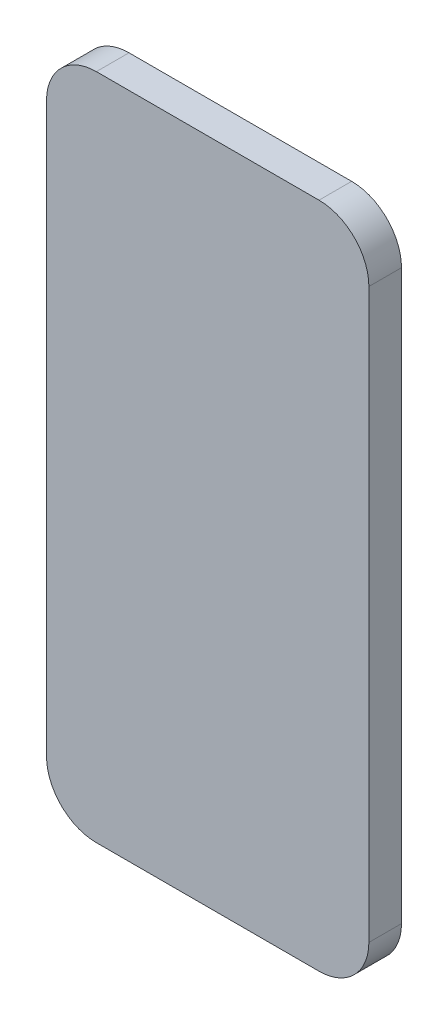
ISO-10303-21;
HEADER;
FILE_DESCRIPTION(('STEP AP214'),'2;1');
FILE_NAME('part.step','',(''),(''),'','','');
FILE_SCHEMA(('AUTOMOTIVE_DESIGN { 1 0 10303 214 1 1 1 1 }'));
ENDSEC;
DATA;
#1=APPLICATION_CONTEXT('core data for automotive mechanical design processes');
#2=APPLICATION_PROTOCOL_DEFINITION('international standard','automotive_design',2000,#1);
#3=PRODUCT_CONTEXT('',#1,'mechanical');
#4=PRODUCT('Part','Part','',(#3));
#5=PRODUCT_RELATED_PRODUCT_CATEGORY('part','',(#4));
#6=PRODUCT_DEFINITION_FORMATION('','',#4);
#7=PRODUCT_DEFINITION_CONTEXT('part definition',#1,'design');
#8=PRODUCT_DEFINITION('design','',#6,#7);
#9=PRODUCT_DEFINITION_SHAPE('','',#8);
#10=(LENGTH_UNIT() NAMED_UNIT(*) SI_UNIT(.MILLI.,.METRE.));
#11=(NAMED_UNIT(*) PLANE_ANGLE_UNIT() SI_UNIT($,.RADIAN.));
#12=(NAMED_UNIT(*) SI_UNIT($,.STERADIAN.) SOLID_ANGLE_UNIT());
#13=UNCERTAINTY_MEASURE_WITH_UNIT(LENGTH_MEASURE(1.E-05),#10,'distance_accuracy_value','');
#14=(GEOMETRIC_REPRESENTATION_CONTEXT(3) GLOBAL_UNCERTAINTY_ASSIGNED_CONTEXT((#13)) GLOBAL_UNIT_ASSIGNED_CONTEXT((#10,
#11,#12)) REPRESENTATION_CONTEXT('',''));
#15=CARTESIAN_POINT('',(0.,0.,0.));
#16=DIRECTION('',(0.,0.,1.));
#17=DIRECTION('',(1.,0.,0.));
#18=AXIS2_PLACEMENT_3D('',#15,#16,#17);
#19=CARTESIAN_POINT('',(12.8139705882353,-72.6825980392157,7.85));
#20=DIRECTION('',(0.,0.,-1.));
#21=DIRECTION('',(-1.,0.,0.));
#22=AXIS2_PLACEMENT_3D('',#19,#20,#21);
#23=CYLINDRICAL_SURFACE('',#22,12.);
#24=CARTESIAN_POINT('',(12.8139705882353,-72.6825980392157,0.));
#25=DIRECTION('',(0.,0.,1.));
#26=DIRECTION('',(1.,0.,0.));
#27=AXIS2_PLACEMENT_3D('',#24,#25,#26);
#28=CIRCLE('',#27,12.);
#29=CARTESIAN_POINT('',(12.8139705882352,-84.6825980392157,0.));
#30=VERTEX_POINT('',#29);
#31=CARTESIAN_POINT('',(24.8139705882353,-72.6825980392156,0.));
#32=VERTEX_POINT('',#31);
#33=EDGE_CURVE('E137',#30,#32,#28,.T.);
#34=ORIENTED_EDGE('',*,*,#33,.T.);
#35=DIRECTION('',(0.,0.,-1.));
#36=VECTOR('',#35,1.);
#37=CARTESIAN_POINT('',(24.8139705882353,-72.6825980392156,7.85));
#38=LINE('',#37,#36);
#39=CARTESIAN_POINT('',(24.8139705882353,-72.6825980392156,7.85));
#40=VERTEX_POINT('',#39);
#41=EDGE_CURVE('E11',#40,#32,#38,.T.);
#42=ORIENTED_EDGE('',*,*,#41,.F.);
#43=CARTESIAN_POINT('',(12.8139705882353,-72.6825980392157,7.85));
#44=DIRECTION('',(0.,0.,1.));
#45=DIRECTION('',(1.,0.,0.));
#46=AXIS2_PLACEMENT_3D('',#43,#44,#45);
#47=CIRCLE('',#46,12.);
#48=CARTESIAN_POINT('',(12.8139705882352,-84.6825980392157,7.85));
#49=VERTEX_POINT('',#48);
#50=EDGE_CURVE('E151',#49,#40,#47,.T.);
#51=ORIENTED_EDGE('',*,*,#50,.F.);
#52=DIRECTION('',(0.,0.,-1.));
#53=VECTOR('',#52,1.);
#54=CARTESIAN_POINT('',(12.8139705882352,-84.6825980392157,7.85));
#55=LINE('',#54,#53);
#56=EDGE_CURVE('E133',#49,#30,#55,.T.);
#57=ORIENTED_EDGE('',*,*,#56,.T.);
#58=EDGE_LOOP('',(#34,#42,#51,#57));
#59=FACE_BOUND('',#58,.T.);
#60=ADVANCED_FACE('F41',(#59),#23,.T.);
#61=CARTESIAN_POINT('',(24.8139705882353,64.0174019607842,7.85));
#62=DIRECTION('',(-1.,0.,0.));
#63=DIRECTION('',(0.,0.,1.));
#64=AXIS2_PLACEMENT_3D('',#61,#62,#63);
#65=PLANE('',#64);
#66=DIRECTION('',(0.,1.,0.));
#67=VECTOR('',#66,1.);
#68=CARTESIAN_POINT('',(24.8139705882353,64.0174019607842,0.));
#69=LINE('',#68,#67);
#70=CARTESIAN_POINT('',(24.8139705882353,64.0174019607842,0.));
#71=VERTEX_POINT('',#70);
#72=EDGE_CURVE('E140',#32,#71,#69,.T.);
#73=ORIENTED_EDGE('',*,*,#72,.T.);
#74=DIRECTION('',(0.,0.,-1.));
#75=VECTOR('',#74,1.);
#76=CARTESIAN_POINT('',(24.8139705882353,64.0174019607842,7.85));
#77=LINE('',#76,#75);
#78=CARTESIAN_POINT('',(24.8139705882353,64.0174019607842,7.85));
#79=VERTEX_POINT('',#78);
#80=EDGE_CURVE('E49',#79,#71,#77,.T.);
#81=ORIENTED_EDGE('',*,*,#80,.F.);
#82=DIRECTION('',(0.,1.,0.));
#83=VECTOR('',#82,1.);
#84=CARTESIAN_POINT('',(24.8139705882353,64.0174019607842,7.85));
#85=LINE('',#84,#83);
#86=EDGE_CURVE('E100',#40,#79,#85,.T.);
#87=ORIENTED_EDGE('',*,*,#86,.F.);
#88=ORIENTED_EDGE('',*,*,#41,.T.);
#89=EDGE_LOOP('',(#73,#81,#87,#88));
#90=FACE_BOUND('',#89,.T.);
#91=ADVANCED_FACE('F186',(#90),#65,.F.);
#92=CARTESIAN_POINT('',(12.8139705882353,64.0174019607843,7.85));
#93=DIRECTION('',(0.,0.,-1.));
#94=DIRECTION('',(-1.,0.,0.));
#95=AXIS2_PLACEMENT_3D('',#92,#93,#94);
#96=CYLINDRICAL_SURFACE('',#95,12.);
#97=CARTESIAN_POINT('',(12.8139705882353,64.0174019607843,0.));
#98=DIRECTION('',(0.,0.,1.));
#99=DIRECTION('',(-1.,0.,0.));
#100=AXIS2_PLACEMENT_3D('',#97,#98,#99);
#101=CIRCLE('',#100,12.);
#102=CARTESIAN_POINT('',(12.8139705882352,76.0174019607843,0.));
#103=VERTEX_POINT('',#102);
#104=EDGE_CURVE('E142',#71,#103,#101,.T.);
#105=ORIENTED_EDGE('',*,*,#104,.T.);
#106=DIRECTION('',(0.,0.,-1.));
#107=VECTOR('',#106,1.);
#108=CARTESIAN_POINT('',(12.8139705882352,76.0174019607843,7.85));
#109=LINE('',#108,#107);
#110=CARTESIAN_POINT('',(12.8139705882352,76.0174019607843,7.85));
#111=VERTEX_POINT('',#110);
#112=EDGE_CURVE('E158',#111,#103,#109,.T.);
#113=ORIENTED_EDGE('',*,*,#112,.F.);
#114=CARTESIAN_POINT('',(12.8139705882353,64.0174019607843,7.85));
#115=DIRECTION('',(0.,0.,1.));
#116=DIRECTION('',(-1.,0.,0.));
#117=AXIS2_PLACEMENT_3D('',#114,#115,#116);
#118=CIRCLE('',#117,12.);
#119=EDGE_CURVE('E166',#79,#111,#118,.T.);
#120=ORIENTED_EDGE('',*,*,#119,.F.);
#121=ORIENTED_EDGE('',*,*,#80,.T.);
#122=EDGE_LOOP('',(#105,#113,#120,#121));
#123=FACE_BOUND('',#122,.T.);
#124=ADVANCED_FACE('F164',(#123),#96,.T.);
#125=CARTESIAN_POINT('',(-40.7660294117646,76.0174019607843,7.85));
#126=DIRECTION('',(0.,-1.,0.));
#127=DIRECTION('',(0.,0.,-1.));
#128=AXIS2_PLACEMENT_3D('',#125,#126,#127);
#129=PLANE('',#128);
#130=DIRECTION('',(-1.,0.,0.));
#131=VECTOR('',#130,1.);
#132=CARTESIAN_POINT('',(-40.7660294117646,76.0174019607843,0.));
#133=LINE('',#132,#131);
#134=CARTESIAN_POINT('',(-40.7660294117646,76.0174019607843,0.));
#135=VERTEX_POINT('',#134);
#136=EDGE_CURVE('E144',#103,#135,#133,.T.);
#137=ORIENTED_EDGE('',*,*,#136,.T.);
#138=DIRECTION('',(0.,0.,-1.));
#139=VECTOR('',#138,1.);
#140=CARTESIAN_POINT('',(-40.7660294117646,76.0174019607843,7.85));
#141=LINE('',#140,#139);
#142=CARTESIAN_POINT('',(-40.7660294117646,76.0174019607843,7.85));
#143=VERTEX_POINT('',#142);
#144=EDGE_CURVE('E155',#143,#135,#141,.T.);
#145=ORIENTED_EDGE('',*,*,#144,.F.);
#146=DIRECTION('',(-1.,0.,0.));
#147=VECTOR('',#146,1.);
#148=CARTESIAN_POINT('',(-40.7660294117646,76.0174019607843,7.85));
#149=LINE('',#148,#147);
#150=EDGE_CURVE('E178',#111,#143,#149,.T.);
#151=ORIENTED_EDGE('',*,*,#150,.F.);
#152=ORIENTED_EDGE('',*,*,#112,.T.);
#153=EDGE_LOOP('',(#137,#145,#151,#152));
#154=FACE_BOUND('',#153,.T.);
#155=ADVANCED_FACE('F174',(#154),#129,.F.);
#156=CARTESIAN_POINT('',(-40.7660294117647,64.0174019607843,7.85));
#157=DIRECTION('',(0.,0.,-1.));
#158=DIRECTION('',(-1.,0.,0.));
#159=AXIS2_PLACEMENT_3D('',#156,#157,#158);
#160=CYLINDRICAL_SURFACE('',#159,12.);
#161=CARTESIAN_POINT('',(-40.7660294117647,64.0174019607843,0.));
#162=DIRECTION('',(0.,0.,1.));
#163=DIRECTION('',(1.,0.,0.));
#164=AXIS2_PLACEMENT_3D('',#161,#162,#163);
#165=CIRCLE('',#164,12.);
#166=CARTESIAN_POINT('',(-52.7660294117647,64.0174019607842,0.));
#167=VERTEX_POINT('',#166);
#168=EDGE_CURVE('E146',#135,#167,#165,.T.);
#169=ORIENTED_EDGE('',*,*,#168,.T.);
#170=DIRECTION('',(0.,0.,-1.));
#171=VECTOR('',#170,1.);
#172=CARTESIAN_POINT('',(-52.7660294117647,64.0174019607842,7.85));
#173=LINE('',#172,#171);
#174=CARTESIAN_POINT('',(-52.7660294117647,64.0174019607842,7.85));
#175=VERTEX_POINT('',#174);
#176=EDGE_CURVE('E128',#175,#167,#173,.T.);
#177=ORIENTED_EDGE('',*,*,#176,.F.);
#178=CARTESIAN_POINT('',(-40.7660294117647,64.0174019607843,7.85));
#179=DIRECTION('',(0.,0.,1.));
#180=DIRECTION('',(1.,0.,0.));
#181=AXIS2_PLACEMENT_3D('',#178,#179,#180);
#182=CIRCLE('',#181,12.);
#183=EDGE_CURVE('E119',#143,#175,#182,.T.);
#184=ORIENTED_EDGE('',*,*,#183,.F.);
#185=ORIENTED_EDGE('',*,*,#144,.T.);
#186=EDGE_LOOP('',(#169,#177,#184,#185));
#187=FACE_BOUND('',#186,.T.);
#188=ADVANCED_FACE('F177',(#187),#160,.T.);
#189=CARTESIAN_POINT('',(-52.7660294117647,64.0174019607842,7.85));
#190=DIRECTION('',(1.,0.,0.));
#191=DIRECTION('',(0.,1.,0.));
#192=AXIS2_PLACEMENT_3D('',#189,#190,#191);
#193=PLANE('',#192);
#194=DIRECTION('',(0.,-1.,0.));
#195=VECTOR('',#194,1.);
#196=CARTESIAN_POINT('',(-52.7660294117647,64.0174019607842,0.));
#197=LINE('',#196,#195);
#198=CARTESIAN_POINT('',(-52.7660294117647,-72.6825980392156,0.));
#199=VERTEX_POINT('',#198);
#200=EDGE_CURVE('E127',#167,#199,#197,.T.);
#201=ORIENTED_EDGE('',*,*,#200,.T.);
#202=DIRECTION('',(0.,0.,-1.));
#203=VECTOR('',#202,1.);
#204=CARTESIAN_POINT('',(-52.7660294117647,-72.6825980392156,7.85));
#205=LINE('',#204,#203);
#206=CARTESIAN_POINT('',(-52.7660294117647,-72.6825980392156,7.85));
#207=VERTEX_POINT('',#206);
#208=EDGE_CURVE('E124',#207,#199,#205,.T.);
#209=ORIENTED_EDGE('',*,*,#208,.F.);
#210=DIRECTION('',(0.,-1.,0.));
#211=VECTOR('',#210,1.);
#212=CARTESIAN_POINT('',(-52.7660294117647,64.0174019607842,7.85));
#213=LINE('',#212,#211);
#214=EDGE_CURVE('E113',#175,#207,#213,.T.);
#215=ORIENTED_EDGE('',*,*,#214,.F.);
#216=ORIENTED_EDGE('',*,*,#176,.T.);
#217=EDGE_LOOP('',(#201,#209,#215,#216));
#218=FACE_BOUND('',#217,.T.);
#219=ADVANCED_FACE('F125',(#218),#193,.F.);
#220=CARTESIAN_POINT('',(-40.7660294117647,-72.6825980392157,7.85));
#221=DIRECTION('',(0.,0.,-1.));
#222=DIRECTION('',(-1.,0.,0.));
#223=AXIS2_PLACEMENT_3D('',#220,#221,#222);
#224=CYLINDRICAL_SURFACE('',#223,12.);
#225=CARTESIAN_POINT('',(-40.7660294117647,-72.6825980392157,0.));
#226=DIRECTION('',(0.,0.,1.));
#227=DIRECTION('',(1.,0.,0.));
#228=AXIS2_PLACEMENT_3D('',#225,#226,#227);
#229=CIRCLE('',#228,12.);
#230=CARTESIAN_POINT('',(-40.7660294117646,-84.6825980392157,0.));
#231=VERTEX_POINT('',#230);
#232=EDGE_CURVE('E86',#199,#231,#229,.T.);
#233=ORIENTED_EDGE('',*,*,#232,.T.);
#234=DIRECTION('',(0.,0.,-1.));
#235=VECTOR('',#234,1.);
#236=CARTESIAN_POINT('',(-40.7660294117646,-84.6825980392157,7.85));
#237=LINE('',#236,#235);
#238=CARTESIAN_POINT('',(-40.7660294117646,-84.6825980392157,7.85));
#239=VERTEX_POINT('',#238);
#240=EDGE_CURVE('E129',#239,#231,#237,.T.);
#241=ORIENTED_EDGE('',*,*,#240,.F.);
#242=CARTESIAN_POINT('',(-40.7660294117647,-72.6825980392157,7.85));
#243=DIRECTION('',(0.,0.,1.));
#244=DIRECTION('',(1.,0.,0.));
#245=AXIS2_PLACEMENT_3D('',#242,#243,#244);
#246=CIRCLE('',#245,12.);
#247=EDGE_CURVE('E117',#207,#239,#246,.T.);
#248=ORIENTED_EDGE('',*,*,#247,.F.);
#249=ORIENTED_EDGE('',*,*,#208,.T.);
#250=EDGE_LOOP('',(#233,#241,#248,#249));
#251=FACE_BOUND('',#250,.T.);
#252=ADVANCED_FACE('F131',(#251),#224,.T.);
#253=CARTESIAN_POINT('',(-40.7660294117646,-84.6825980392157,7.85));
#254=DIRECTION('',(0.,1.,0.));
#255=DIRECTION('',(0.,0.,1.));
#256=AXIS2_PLACEMENT_3D('',#253,#254,#255);
#257=PLANE('',#256);
#258=DIRECTION('',(1.,0.,0.));
#259=VECTOR('',#258,1.);
#260=CARTESIAN_POINT('',(-40.7660294117646,-84.6825980392157,0.));
#261=LINE('',#260,#259);
#262=EDGE_CURVE('E92',#231,#30,#261,.T.);
#263=ORIENTED_EDGE('',*,*,#262,.T.);
#264=ORIENTED_EDGE('',*,*,#56,.F.);
#265=DIRECTION('',(1.,0.,0.));
#266=VECTOR('',#265,1.);
#267=CARTESIAN_POINT('',(-40.7660294117646,-84.6825980392157,7.85));
#268=LINE('',#267,#266);
#269=EDGE_CURVE('E57',#239,#49,#268,.T.);
#270=ORIENTED_EDGE('',*,*,#269,.F.);
#271=ORIENTED_EDGE('',*,*,#240,.T.);
#272=EDGE_LOOP('',(#263,#264,#270,#271));
#273=FACE_BOUND('',#272,.T.);
#274=ADVANCED_FACE('F202',(#273),#257,.F.);
#275=CARTESIAN_POINT('',(12.8139705882353,-72.6825980392157,7.85));
#276=DIRECTION('',(0.,0.,1.));
#277=DIRECTION('',(1.,0.,0.));
#278=AXIS2_PLACEMENT_3D('',#275,#276,#277);
#279=PLANE('',#278);
#280=ORIENTED_EDGE('',*,*,#50,.T.);
#281=ORIENTED_EDGE('',*,*,#86,.T.);
#282=ORIENTED_EDGE('',*,*,#119,.T.);
#283=ORIENTED_EDGE('',*,*,#150,.T.);
#284=ORIENTED_EDGE('',*,*,#183,.T.);
#285=ORIENTED_EDGE('',*,*,#214,.T.);
#286=ORIENTED_EDGE('',*,*,#247,.T.);
#287=ORIENTED_EDGE('',*,*,#269,.T.);
#288=EDGE_LOOP('',(#280,#281,#282,#283,#284,#285,#286,#287));
#289=FACE_BOUND('',#288,.T.);
#290=ADVANCED_FACE('F115',(#289),#279,.T.);
#291=CARTESIAN_POINT('',(12.8139705882353,-72.6825980392157,0.));
#292=DIRECTION('',(0.,0.,1.));
#293=DIRECTION('',(1.,0.,0.));
#294=AXIS2_PLACEMENT_3D('',#291,#292,#293);
#295=PLANE('',#294);
#296=ORIENTED_EDGE('',*,*,#33,.F.);
#297=ORIENTED_EDGE('',*,*,#262,.F.);
#298=ORIENTED_EDGE('',*,*,#232,.F.);
#299=ORIENTED_EDGE('',*,*,#200,.F.);
#300=ORIENTED_EDGE('',*,*,#168,.F.);
#301=ORIENTED_EDGE('',*,*,#136,.F.);
#302=ORIENTED_EDGE('',*,*,#104,.F.);
#303=ORIENTED_EDGE('',*,*,#72,.F.);
#304=EDGE_LOOP('',(#296,#297,#298,#299,#300,#301,#302,#303));
#305=FACE_BOUND('',#304,.T.);
#306=ADVANCED_FACE('F170',(#305),#295,.F.);
#307=CLOSED_SHELL('',(#60,#91,#124,#155,#188,#219,#252,#274,#290,#306));
#308=MANIFOLD_SOLID_BREP('B2',#307);
#309=ADVANCED_BREP_SHAPE_REPRESENTATION('',(#18,#308),#14);
#310=SHAPE_DEFINITION_REPRESENTATION(#9,#309);
ENDSEC;
END-ISO-10303-21;
